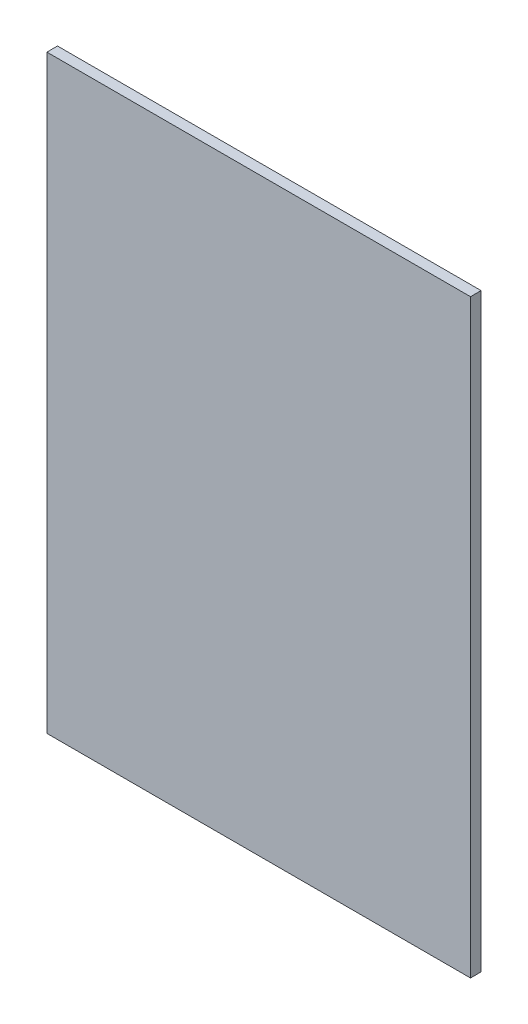
ISO-10303-21;
HEADER;
FILE_DESCRIPTION(('STEP AP214'),'2;1');
FILE_NAME('part.step','',(''),(''),'','','');
FILE_SCHEMA(('AUTOMOTIVE_DESIGN { 1 0 10303 214 1 1 1 1 }'));
ENDSEC;
DATA;
#1=APPLICATION_CONTEXT('core data for automotive mechanical design processes');
#2=APPLICATION_PROTOCOL_DEFINITION('international standard','automotive_design',2000,#1);
#3=PRODUCT_CONTEXT('',#1,'mechanical');
#4=PRODUCT('Part','Part','',(#3));
#5=PRODUCT_RELATED_PRODUCT_CATEGORY('part','',(#4));
#6=PRODUCT_DEFINITION_FORMATION('','',#4);
#7=PRODUCT_DEFINITION_CONTEXT('part definition',#1,'design');
#8=PRODUCT_DEFINITION('design','',#6,#7);
#9=PRODUCT_DEFINITION_SHAPE('','',#8);
#10=(LENGTH_UNIT() NAMED_UNIT(*) SI_UNIT(.MILLI.,.METRE.));
#11=(NAMED_UNIT(*) PLANE_ANGLE_UNIT() SI_UNIT($,.RADIAN.));
#12=(NAMED_UNIT(*) SI_UNIT($,.STERADIAN.) SOLID_ANGLE_UNIT());
#13=UNCERTAINTY_MEASURE_WITH_UNIT(LENGTH_MEASURE(1.E-05),#10,'distance_accuracy_value','');
#14=(GEOMETRIC_REPRESENTATION_CONTEXT(3) GLOBAL_UNCERTAINTY_ASSIGNED_CONTEXT((#13)) GLOBAL_UNIT_ASSIGNED_CONTEXT((#10,
#11,#12)) REPRESENTATION_CONTEXT('',''));
#15=CARTESIAN_POINT('',(0.,0.,0.));
#16=DIRECTION('',(0.,0.,1.));
#17=DIRECTION('',(1.,0.,0.));
#18=AXIS2_PLACEMENT_3D('',#15,#16,#17);
#19=CARTESIAN_POINT('',(-2493.6139271973,-278.570832902123,5.));
#20=DIRECTION('',(1.,0.,0.));
#21=DIRECTION('',(0.,1.,0.));
#22=AXIS2_PLACEMENT_3D('',#19,#20,#21);
#23=PLANE('',#22);
#24=DIRECTION('',(0.,-1.,0.));
#25=VECTOR('',#24,1.);
#26=CARTESIAN_POINT('',(-2493.6139271973,-278.570832902123,0.));
#27=LINE('',#26,#25);
#28=CARTESIAN_POINT('',(-2493.6139271973,0.,0.));
#29=VERTEX_POINT('',#28);
#30=CARTESIAN_POINT('',(-2493.6139271973,-278.570832902123,0.));
#31=VERTEX_POINT('',#30);
#32=EDGE_CURVE('E96',#29,#31,#27,.T.);
#33=ORIENTED_EDGE('',*,*,#32,.T.);
#34=DIRECTION('',(0.,0.,-1.));
#35=VECTOR('',#34,1.);
#36=CARTESIAN_POINT('',(-2493.6139271973,-278.570832902123,5.));
#37=LINE('',#36,#35);
#38=CARTESIAN_POINT('',(-2493.6139271973,-278.570832902123,5.));
#39=VERTEX_POINT('',#38);
#40=EDGE_CURVE('E11',#39,#31,#37,.T.);
#41=ORIENTED_EDGE('',*,*,#40,.F.);
#42=DIRECTION('',(0.,-1.,0.));
#43=VECTOR('',#42,1.);
#44=CARTESIAN_POINT('',(-2493.6139271973,-278.570832902123,5.));
#45=LINE('',#44,#43);
#46=CARTESIAN_POINT('',(-2493.6139271973,0.,5.));
#47=VERTEX_POINT('',#46);
#48=EDGE_CURVE('E84',#47,#39,#45,.T.);
#49=ORIENTED_EDGE('',*,*,#48,.F.);
#50=DIRECTION('',(0.,0.,-1.));
#51=VECTOR('',#50,1.);
#52=CARTESIAN_POINT('',(-2493.6139271973,0.,5.));
#53=LINE('',#52,#51);
#54=EDGE_CURVE('E92',#47,#29,#53,.T.);
#55=ORIENTED_EDGE('',*,*,#54,.T.);
#56=EDGE_LOOP('',(#33,#41,#49,#55));
#57=FACE_BOUND('',#56,.T.);
#58=ADVANCED_FACE('F33',(#57),#23,.F.);
#59=CARTESIAN_POINT('',(-2493.6139271973,-278.570832902123,5.));
#60=DIRECTION('',(0.,1.,0.));
#61=DIRECTION('',(0.,0.,1.));
#62=AXIS2_PLACEMENT_3D('',#59,#60,#61);
#63=PLANE('',#62);
#64=DIRECTION('',(1.,0.,0.));
#65=VECTOR('',#64,1.);
#66=CARTESIAN_POINT('',(-2493.6139271973,-278.570832902123,0.));
#67=LINE('',#66,#65);
#68=CARTESIAN_POINT('',(-2293.6139271973,-278.570832902123,0.));
#69=VERTEX_POINT('',#68);
#70=EDGE_CURVE('E88',#31,#69,#67,.T.);
#71=ORIENTED_EDGE('',*,*,#70,.T.);
#72=DIRECTION('',(0.,0.,-1.));
#73=VECTOR('',#72,1.);
#74=CARTESIAN_POINT('',(-2293.6139271973,-278.570832902123,5.));
#75=LINE('',#74,#73);
#76=CARTESIAN_POINT('',(-2293.6139271973,-278.570832902123,5.));
#77=VERTEX_POINT('',#76);
#78=EDGE_CURVE('E41',#77,#69,#75,.T.);
#79=ORIENTED_EDGE('',*,*,#78,.F.);
#80=DIRECTION('',(1.,0.,0.));
#81=VECTOR('',#80,1.);
#82=CARTESIAN_POINT('',(-2493.6139271973,-278.570832902123,5.));
#83=LINE('',#82,#81);
#84=EDGE_CURVE('E79',#39,#77,#83,.T.);
#85=ORIENTED_EDGE('',*,*,#84,.F.);
#86=ORIENTED_EDGE('',*,*,#40,.T.);
#87=EDGE_LOOP('',(#71,#79,#85,#86));
#88=FACE_BOUND('',#87,.T.);
#89=ADVANCED_FACE('F87',(#88),#63,.F.);
#90=CARTESIAN_POINT('',(-2293.6139271973,-278.570832902123,5.));
#91=DIRECTION('',(-1.,0.,0.));
#92=DIRECTION('',(0.,0.,1.));
#93=AXIS2_PLACEMENT_3D('',#90,#91,#92);
#94=PLANE('',#93);
#95=DIRECTION('',(0.,1.,0.));
#96=VECTOR('',#95,1.);
#97=CARTESIAN_POINT('',(-2293.6139271973,-278.570832902123,0.));
#98=LINE('',#97,#96);
#99=CARTESIAN_POINT('',(-2293.6139271973,0.,0.));
#100=VERTEX_POINT('',#99);
#101=EDGE_CURVE('E66',#69,#100,#98,.T.);
#102=ORIENTED_EDGE('',*,*,#101,.T.);
#103=DIRECTION('',(0.,0.,-1.));
#104=VECTOR('',#103,1.);
#105=CARTESIAN_POINT('',(-2293.6139271973,0.,5.));
#106=LINE('',#105,#104);
#107=CARTESIAN_POINT('',(-2293.6139271973,0.,5.));
#108=VERTEX_POINT('',#107);
#109=EDGE_CURVE('E89',#108,#100,#106,.T.);
#110=ORIENTED_EDGE('',*,*,#109,.F.);
#111=DIRECTION('',(0.,1.,0.));
#112=VECTOR('',#111,1.);
#113=CARTESIAN_POINT('',(-2293.6139271973,-278.570832902123,5.));
#114=LINE('',#113,#112);
#115=EDGE_CURVE('E82',#77,#108,#114,.T.);
#116=ORIENTED_EDGE('',*,*,#115,.F.);
#117=ORIENTED_EDGE('',*,*,#78,.T.);
#118=EDGE_LOOP('',(#102,#110,#116,#117));
#119=FACE_BOUND('',#118,.T.);
#120=ADVANCED_FACE('F90',(#119),#94,.F.);
#121=CARTESIAN_POINT('',(-2493.6139271973,0.,5.));
#122=DIRECTION('',(0.,-1.,0.));
#123=DIRECTION('',(1.,0.,0.));
#124=AXIS2_PLACEMENT_3D('',#121,#122,#123);
#125=PLANE('',#124);
#126=DIRECTION('',(-1.,0.,0.));
#127=VECTOR('',#126,1.);
#128=CARTESIAN_POINT('',(-2493.6139271973,0.,0.));
#129=LINE('',#128,#127);
#130=EDGE_CURVE('E72',#100,#29,#129,.T.);
#131=ORIENTED_EDGE('',*,*,#130,.T.);
#132=ORIENTED_EDGE('',*,*,#54,.F.);
#133=DIRECTION('',(-1.,0.,0.));
#134=VECTOR('',#133,1.);
#135=CARTESIAN_POINT('',(-2493.6139271973,0.,5.));
#136=LINE('',#135,#134);
#137=EDGE_CURVE('E49',#108,#47,#136,.T.);
#138=ORIENTED_EDGE('',*,*,#137,.F.);
#139=ORIENTED_EDGE('',*,*,#109,.T.);
#140=EDGE_LOOP('',(#131,#132,#138,#139));
#141=FACE_BOUND('',#140,.T.);
#142=ADVANCED_FACE('F103',(#141),#125,.F.);
#143=CARTESIAN_POINT('',(0.,0.,5.));
#144=DIRECTION('',(0.,0.,-1.));
#145=DIRECTION('',(-1.,0.,0.));
#146=AXIS2_PLACEMENT_3D('',#143,#144,#145);
#147=PLANE('',#146);
#148=ORIENTED_EDGE('',*,*,#48,.T.);
#149=ORIENTED_EDGE('',*,*,#84,.T.);
#150=ORIENTED_EDGE('',*,*,#115,.T.);
#151=ORIENTED_EDGE('',*,*,#137,.T.);
#152=EDGE_LOOP('',(#148,#149,#150,#151));
#153=FACE_BOUND('',#152,.T.);
#154=ADVANCED_FACE('F80',(#153),#147,.F.);
#155=CARTESIAN_POINT('',(0.,0.,0.));
#156=DIRECTION('',(0.,0.,-1.));
#157=DIRECTION('',(-1.,0.,0.));
#158=AXIS2_PLACEMENT_3D('',#155,#156,#157);
#159=PLANE('',#158);
#160=ORIENTED_EDGE('',*,*,#32,.F.);
#161=ORIENTED_EDGE('',*,*,#130,.F.);
#162=ORIENTED_EDGE('',*,*,#101,.F.);
#163=ORIENTED_EDGE('',*,*,#70,.F.);
#164=EDGE_LOOP('',(#160,#161,#162,#163));
#165=FACE_BOUND('',#164,.T.);
#166=ADVANCED_FACE('F106',(#165),#159,.T.);
#167=CLOSED_SHELL('',(#58,#89,#120,#142,#154,#166));
#168=MANIFOLD_SOLID_BREP('B2',#167);
#169=ADVANCED_BREP_SHAPE_REPRESENTATION('',(#18,#168),#14);
#170=SHAPE_DEFINITION_REPRESENTATION(#9,#169);
ENDSEC;
END-ISO-10303-21;
